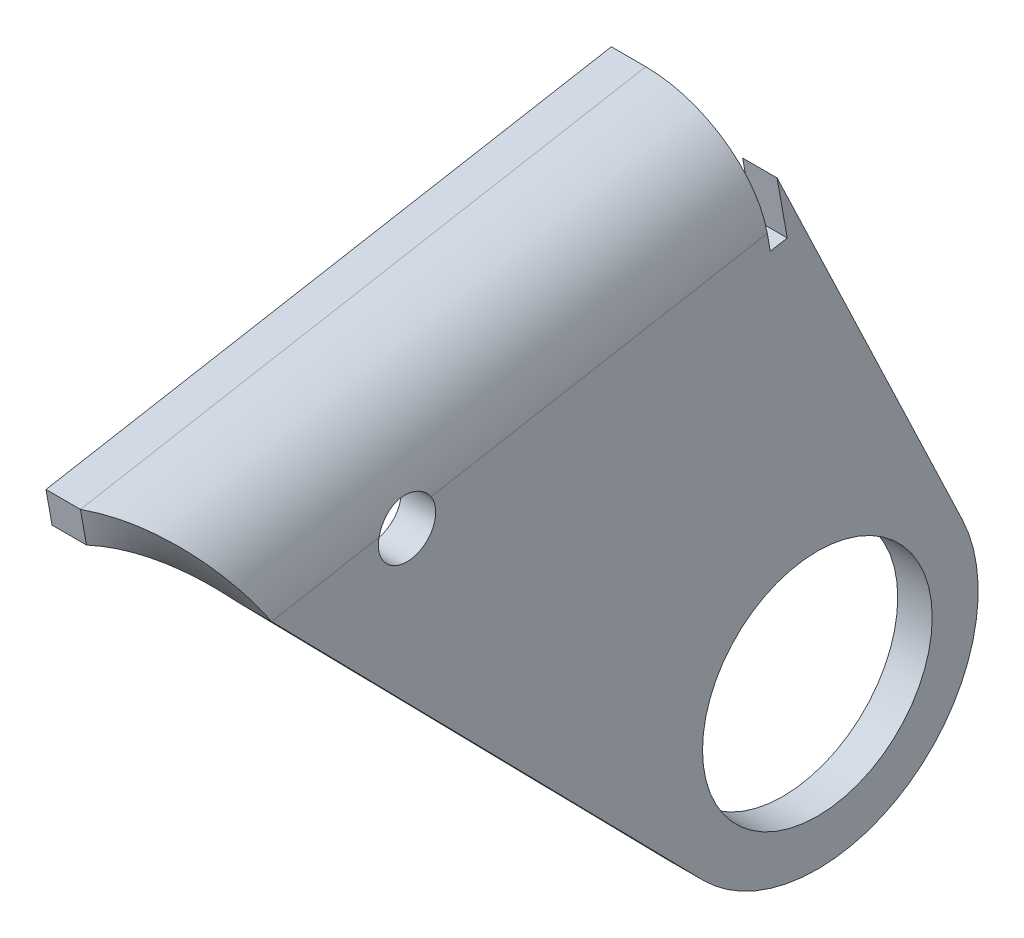
ISO-10303-21;
HEADER;
FILE_DESCRIPTION(('STEP AP214'),'2;1');
FILE_NAME('part.step','',(''),(''),'','','');
FILE_SCHEMA(('AUTOMOTIVE_DESIGN { 1 0 10303 214 1 1 1 1 }'));
ENDSEC;
DATA;
#1=APPLICATION_CONTEXT('core data for automotive mechanical design processes');
#2=APPLICATION_PROTOCOL_DEFINITION('international standard','automotive_design',2000,#1);
#3=PRODUCT_CONTEXT('',#1,'mechanical');
#4=PRODUCT('Part','Part','',(#3));
#5=PRODUCT_RELATED_PRODUCT_CATEGORY('part','',(#4));
#6=PRODUCT_DEFINITION_FORMATION('','',#4);
#7=PRODUCT_DEFINITION_CONTEXT('part definition',#1,'design');
#8=PRODUCT_DEFINITION('design','',#6,#7);
#9=PRODUCT_DEFINITION_SHAPE('','',#8);
#10=(LENGTH_UNIT() NAMED_UNIT(*) SI_UNIT(.MILLI.,.METRE.));
#11=(NAMED_UNIT(*) PLANE_ANGLE_UNIT() SI_UNIT($,.RADIAN.));
#12=(NAMED_UNIT(*) SI_UNIT($,.STERADIAN.) SOLID_ANGLE_UNIT());
#13=UNCERTAINTY_MEASURE_WITH_UNIT(LENGTH_MEASURE(1.E-05),#10,'distance_accuracy_value','');
#14=(GEOMETRIC_REPRESENTATION_CONTEXT(3) GLOBAL_UNCERTAINTY_ASSIGNED_CONTEXT((#13)) GLOBAL_UNIT_ASSIGNED_CONTEXT((#10,
#11,#12)) REPRESENTATION_CONTEXT('',''));
#15=CARTESIAN_POINT('',(0.,0.,0.));
#16=DIRECTION('',(0.,0.,1.));
#17=DIRECTION('',(1.,0.,0.));
#18=AXIS2_PLACEMENT_3D('',#15,#16,#17);
#19=CARTESIAN_POINT('',(3.,6.02391953035933,-12.6377368817267));
#20=DIRECTION('',(0.,0.430279966454238,-0.902695491551908));
#21=DIRECTION('',(0.,-0.902695491551908,-0.430279966454238));
#22=AXIS2_PLACEMENT_3D('',#19,#20,#21);
#23=PLANE('',#22);
#24=DIRECTION('',(0.,-0.902695491551908,-0.430279966454238));
#25=VECTOR('',#24,1.);
#26=CARTESIAN_POINT('',(3.,6.02391953035933,-12.6377368817267));
#27=LINE('',#26,#25);
#28=CARTESIAN_POINT('',(3.,39.8963585818371,3.50794244778505));
#29=VERTEX_POINT('',#28);
#30=CARTESIAN_POINT('',(3.,6.02391953035933,-12.6377368817267));
#31=VERTEX_POINT('',#30);
#32=EDGE_CURVE('E255',#29,#31,#27,.T.);
#33=ORIENTED_EDGE('',*,*,#32,.T.);
#34=DIRECTION('',(1.,0.,0.));
#35=VECTOR('',#34,1.);
#36=CARTESIAN_POINT('',(3.,6.02391953035933,-12.6377368817267));
#37=LINE('',#36,#35);
#38=CARTESIAN_POINT('',(0.,6.02391953035933,-12.6377368817267));
#39=VERTEX_POINT('',#38);
#40=EDGE_CURVE('E11',#39,#31,#37,.T.);
#41=ORIENTED_EDGE('',*,*,#40,.F.);
#42=DIRECTION('',(0.,-0.902695491551908,-0.430279966454238));
#43=VECTOR('',#42,1.);
#44=CARTESIAN_POINT('',(0.,6.02391953035933,-12.6377368817267));
#45=LINE('',#44,#43);
#46=CARTESIAN_POINT('',(0.,39.8963585818371,3.50794244778505));
#47=VERTEX_POINT('',#46);
#48=EDGE_CURVE('E239',#47,#39,#45,.T.);
#49=ORIENTED_EDGE('',*,*,#48,.F.);
#50=DIRECTION('',(1.,0.,0.));
#51=VECTOR('',#50,1.);
#52=CARTESIAN_POINT('',(0.,39.8963585818371,3.50794244778505));
#53=LINE('',#52,#51);
#54=EDGE_CURVE('E525',#47,#29,#53,.T.);
#55=ORIENTED_EDGE('',*,*,#54,.T.);
#56=EDGE_LOOP('',(#33,#41,#49,#55));
#57=FACE_BOUND('',#56,.T.);
#58=ADVANCED_FACE('F41',(#57),#23,.T.);
#59=CARTESIAN_POINT('',(3.,-9.80528539738687,9.9928163335364));
#60=DIRECTION('',(0.,-0.700377528384777,0.7137725952526));
#61=DIRECTION('',(0.,0.7137725952526,0.700377528384777));
#62=AXIS2_PLACEMENT_3D('',#59,#60,#61);
#63=PLANE('',#62);
#64=DIRECTION('',(0.,0.7137725952526,0.700377528384777));
#65=VECTOR('',#64,1.);
#66=CARTESIAN_POINT('',(0.,-9.80528539738687,9.9928163335364));
#67=LINE('',#66,#65);
#68=CARTESIAN_POINT('',(0.,-9.80528539738687,9.9928163335364));
#69=VERTEX_POINT('',#68);
#70=CARTESIAN_POINT('',(0.,28.4500932309683,47.5302725336714));
#71=VERTEX_POINT('',#70);
#72=EDGE_CURVE('E156',#69,#71,#67,.T.);
#73=ORIENTED_EDGE('',*,*,#72,.F.);
#74=DIRECTION('',(1.,0.,0.));
#75=VECTOR('',#74,1.);
#76=CARTESIAN_POINT('',(3.,-9.80528539738687,9.9928163335364));
#77=LINE('',#76,#75);
#78=CARTESIAN_POINT('',(3.,-9.80528539738687,9.9928163335364));
#79=VERTEX_POINT('',#78);
#80=EDGE_CURVE('E45',#69,#79,#77,.T.);
#81=ORIENTED_EDGE('',*,*,#80,.T.);
#82=DIRECTION('',(0.,0.7137725952526,0.700377528384777));
#83=VECTOR('',#82,1.);
#84=CARTESIAN_POINT('',(3.,-9.80528539738687,9.9928163335364));
#85=LINE('',#84,#83);
#86=CARTESIAN_POINT('',(3.00000000000002,28.4500932309683,47.5302725336714));
#87=VERTEX_POINT('',#86);
#88=EDGE_CURVE('E252',#79,#87,#85,.T.);
#89=ORIENTED_EDGE('',*,*,#88,.T.);
#90=DIRECTION('',(1.,0.,0.));
#91=VECTOR('',#90,1.);
#92=CARTESIAN_POINT('',(0.,28.4500932309683,47.5302725336714));
#93=LINE('',#92,#91);
#94=EDGE_CURVE('E238',#71,#87,#93,.T.);
#95=ORIENTED_EDGE('',*,*,#94,.F.);
#96=EDGE_LOOP('',(#73,#81,#89,#95));
#97=FACE_BOUND('',#96,.T.);
#98=ADVANCED_FACE('F220',(#97),#63,.T.);
#99=CARTESIAN_POINT('',(3.,0.,0.));
#100=DIRECTION('',(1.,0.,0.));
#101=DIRECTION('',(0.,0.,1.));
#102=AXIS2_PLACEMENT_3D('',#99,#100,#101);
#103=PLANE('',#102);
#104=CARTESIAN_POINT('',(3.,29.5616466641998,35.7330467634988));
#105=DIRECTION('',(-1.,0.,0.));
#106=DIRECTION('',(0.,0.,1.));
#107=AXIS2_PLACEMENT_3D('',#104,#105,#106);
#108=CIRCLE('',#107,2.5);
#109=CARTESIAN_POINT('',(3.00000000000001,30.9247946626455,33.6373780076279));
#110=VERTEX_POINT('',#109);
#111=CARTESIAN_POINT('',(3.00000000000002,30.1173209026301,38.1705098177305));
#112=VERTEX_POINT('',#111);
#113=EDGE_CURVE('E472',#110,#112,#108,.T.);
#114=ORIENTED_EDGE('',*,*,#113,.T.);
#115=DIRECTION('',(0.,-0.175366726091987,0.984503179974437));
#116=VECTOR('',#115,1.);
#117=CARTESIAN_POINT('',(3.00000000000002,27.3711350756307,53.5875090383433));
#118=LINE('',#117,#116);
#119=EDGE_CURVE('E507',#87,#112,#118,.F.);
#120=ORIENTED_EDGE('',*,*,#119,.F.);
#121=ORIENTED_EDGE('',*,*,#88,.F.);
#122=CARTESIAN_POINT('',(3.,0.,0.));
#123=DIRECTION('',(-1.,0.,0.));
#124=DIRECTION('',(0.,0.,1.));
#125=AXIS2_PLACEMENT_3D('',#122,#123,#124);
#126=CIRCLE('',#125,14.);
#127=EDGE_CURVE('E249',#31,#79,#126,.T.);
#128=ORIENTED_EDGE('',*,*,#127,.F.);
#129=ORIENTED_EDGE('',*,*,#32,.F.);
#130=DIRECTION('',(0.,0.984503179974436,0.175366726091989));
#131=VECTOR('',#130,1.);
#132=CARTESIAN_POINT('',(3.,0.6213091049295,-3.48800940281742));
#133=LINE('',#132,#131);
#134=CARTESIAN_POINT('',(3.,34.9257666994064,2.62254518052185));
#135=VERTEX_POINT('',#134);
#136=EDGE_CURVE('E532',#135,#29,#133,.T.);
#137=ORIENTED_EDGE('',*,*,#136,.F.);
#138=DIRECTION('',(0.,0.175366726091988,-0.984503179974436));
#139=VECTOR('',#138,1.);
#140=CARTESIAN_POINT('',(3.,34.3044575944769,6.11055458333925));
#141=LINE('',#140,#139);
#142=CARTESIAN_POINT('',(3.,34.6627166102684,4.09929995048351));
#143=VERTEX_POINT('',#142);
#144=EDGE_CURVE('E533',#143,#135,#141,.T.);
#145=ORIENTED_EDGE('',*,*,#144,.F.);
#146=DIRECTION('',(0.,-0.984503179974436,-0.175366726091988));
#147=VECTOR('',#146,1.);
#148=CARTESIAN_POINT('',(3.,0.358259015791509,-2.01125463285573));
#149=LINE('',#148,#147);
#150=CARTESIAN_POINT('',(3.,36.1394713802301,4.36235003962149));
#151=VERTEX_POINT('',#150);
#152=EDGE_CURVE('E245',#151,#143,#149,.T.);
#153=ORIENTED_EDGE('',*,*,#152,.F.);
#154=EDGE_CURVE('E508',#110,#151,#118,.F.);
#155=ORIENTED_EDGE('',*,*,#154,.F.);
#156=EDGE_LOOP('',(#114,#120,#121,#128,#129,#137,#145,#153,#155));
#157=FACE_BOUND('',#156,.T.);
#158=CARTESIAN_POINT('',(3.,0.,0.));
#159=DIRECTION('',(-1.,0.,0.));
#160=DIRECTION('',(0.,0.,1.));
#161=AXIS2_PLACEMENT_3D('',#158,#159,#160);
#162=CIRCLE('',#161,10.);
#163=CARTESIAN_POINT('',(3.,0.,10.));
#164=VERTEX_POINT('',#163);
#165=EDGE_CURVE('E262',#164,#164,#162,.T.);
#166=ORIENTED_EDGE('',*,*,#165,.T.);
#167=EDGE_LOOP('',(#166));
#168=FACE_BOUND('',#167,.T.);
#169=ADVANCED_FACE('F217',(#157,#168),#103,.T.);
#170=CARTESIAN_POINT('',(0.,0.,0.));
#171=DIRECTION('',(1.,0.,0.));
#172=DIRECTION('',(0.,0.,1.));
#173=AXIS2_PLACEMENT_3D('',#170,#171,#172);
#174=PLANE('',#173);
#175=CARTESIAN_POINT('',(0.,0.,0.));
#176=DIRECTION('',(-1.,0.,0.));
#177=DIRECTION('',(0.,0.,1.));
#178=AXIS2_PLACEMENT_3D('',#175,#176,#177);
#179=CIRCLE('',#178,10.);
#180=CARTESIAN_POINT('',(0.,0.,10.));
#181=VERTEX_POINT('',#180);
#182=EDGE_CURVE('E243',#181,#181,#179,.T.);
#183=ORIENTED_EDGE('',*,*,#182,.F.);
#184=EDGE_LOOP('',(#183));
#185=FACE_BOUND('',#184,.T.);
#186=DIRECTION('',(0.,-0.175366726091987,0.984503179974437));
#187=VECTOR('',#186,1.);
#188=CARTESIAN_POINT('',(0.,27.3711350756307,53.5875090383433));
#189=LINE('',#188,#187);
#190=CARTESIAN_POINT('',(0.,30.9247946626455,33.6373780076279));
#191=VERTEX_POINT('',#190);
#192=CARTESIAN_POINT('',(0.,36.1394713802301,4.36235003962149));
#193=VERTEX_POINT('',#192);
#194=EDGE_CURVE('E149',#191,#193,#189,.F.);
#195=ORIENTED_EDGE('',*,*,#194,.T.);
#196=DIRECTION('',(0.,-0.984503179974436,-0.175366726091988));
#197=VECTOR('',#196,1.);
#198=CARTESIAN_POINT('',(0.,36.1394713802301,4.36235003962149));
#199=LINE('',#198,#197);
#200=CARTESIAN_POINT('',(0.,34.6627166102684,4.09929995048351));
#201=VERTEX_POINT('',#200);
#202=EDGE_CURVE('E187',#193,#201,#199,.T.);
#203=ORIENTED_EDGE('',*,*,#202,.T.);
#204=DIRECTION('',(0.,0.175366726091988,-0.984503179974436));
#205=VECTOR('',#204,1.);
#206=CARTESIAN_POINT('',(0.,34.6627166102684,4.09929995048351));
#207=LINE('',#206,#205);
#208=CARTESIAN_POINT('',(0.,34.9257666994064,2.62254518052185));
#209=VERTEX_POINT('',#208);
#210=EDGE_CURVE('E531',#201,#209,#207,.T.);
#211=ORIENTED_EDGE('',*,*,#210,.T.);
#212=DIRECTION('',(0.,0.984503179974436,0.175366726091989));
#213=VECTOR('',#212,1.);
#214=CARTESIAN_POINT('',(0.,34.9257666994064,2.62254518052185));
#215=LINE('',#214,#213);
#216=EDGE_CURVE('E521',#209,#47,#215,.T.);
#217=ORIENTED_EDGE('',*,*,#216,.T.);
#218=ORIENTED_EDGE('',*,*,#48,.T.);
#219=CARTESIAN_POINT('',(0.,0.,0.));
#220=DIRECTION('',(-1.,0.,0.));
#221=DIRECTION('',(0.,0.,1.));
#222=AXIS2_PLACEMENT_3D('',#219,#220,#221);
#223=CIRCLE('',#222,14.);
#224=EDGE_CURVE('E240',#39,#69,#223,.T.);
#225=ORIENTED_EDGE('',*,*,#224,.T.);
#226=ORIENTED_EDGE('',*,*,#72,.T.);
#227=CARTESIAN_POINT('',(0.,30.1173209026301,38.1705098177305));
#228=VERTEX_POINT('',#227);
#229=EDGE_CURVE('E146',#71,#228,#189,.F.);
#230=ORIENTED_EDGE('',*,*,#229,.T.);
#231=CARTESIAN_POINT('',(0.,29.5616466641998,35.7330467634988));
#232=DIRECTION('',(1.,0.,0.));
#233=DIRECTION('',(0.,0.,-1.));
#234=AXIS2_PLACEMENT_3D('',#231,#232,#233);
#235=CIRCLE('',#234,2.49999999999999);
#236=EDGE_CURVE('E138',#228,#191,#235,.T.);
#237=ORIENTED_EDGE('',*,*,#236,.T.);
#238=EDGE_LOOP('',(#195,#203,#211,#217,#218,#225,#226,#230,#237));
#239=FACE_BOUND('',#238,.T.);
#240=ADVANCED_FACE('F154',(#185,#239),#174,.F.);
#241=CARTESIAN_POINT('',(3.,0.,0.));
#242=DIRECTION('',(1.,0.,0.));
#243=DIRECTION('',(0.,0.,1.));
#244=AXIS2_PLACEMENT_3D('',#241,#242,#243);
#245=CYLINDRICAL_SURFACE('',#244,14.);
#246=ORIENTED_EDGE('',*,*,#40,.T.);
#247=ORIENTED_EDGE('',*,*,#127,.T.);
#248=ORIENTED_EDGE('',*,*,#80,.F.);
#249=ORIENTED_EDGE('',*,*,#224,.F.);
#250=EDGE_LOOP('',(#246,#247,#248,#249));
#251=FACE_BOUND('',#250,.T.);
#252=ADVANCED_FACE('F224',(#251),#245,.T.);
#253=CARTESIAN_POINT('',(3.,0.,0.));
#254=DIRECTION('',(1.,0.,0.));
#255=DIRECTION('',(0.,0.,1.));
#256=AXIS2_PLACEMENT_3D('',#253,#254,#255);
#257=CYLINDRICAL_SURFACE('',#256,10.);
#258=ORIENTED_EDGE('',*,*,#165,.F.);
#259=EDGE_LOOP('',(#258));
#260=FACE_BOUND('',#259,.T.);
#261=ORIENTED_EDGE('',*,*,#182,.T.);
#262=EDGE_LOOP('',(#261));
#263=FACE_BOUND('',#262,.T.);
#264=ADVANCED_FACE('F43',(#260,#263),#257,.F.);
#265=CARTESIAN_POINT('',(0.,36.1394713802301,4.36235003962149));
#266=DIRECTION('',(0.,0.175366726091988,-0.984503179974436));
#267=DIRECTION('',(0.,-0.984503179974436,-0.175366726091988));
#268=AXIS2_PLACEMENT_3D('',#265,#266,#267);
#269=PLANE('',#268);
#270=ORIENTED_EDGE('',*,*,#152,.T.);
#271=DIRECTION('',(1.,0.,0.));
#272=VECTOR('',#271,1.);
#273=CARTESIAN_POINT('',(0.,34.6627166102684,4.09929995048351));
#274=LINE('',#273,#272);
#275=EDGE_CURVE('E529',#201,#143,#274,.T.);
#276=ORIENTED_EDGE('',*,*,#275,.F.);
#277=ORIENTED_EDGE('',*,*,#202,.F.);
#278=DIRECTION('',(1.,0.,0.));
#279=VECTOR('',#278,1.);
#280=CARTESIAN_POINT('',(0.,36.1394713802301,4.36235003962149));
#281=LINE('',#280,#279);
#282=EDGE_CURVE('E515',#193,#151,#281,.T.);
#283=ORIENTED_EDGE('',*,*,#282,.T.);
#284=EDGE_LOOP('',(#270,#276,#277,#283));
#285=FACE_BOUND('',#284,.T.);
#286=ADVANCED_FACE('F212',(#285),#269,.T.);
#287=CARTESIAN_POINT('',(0.,34.6627166102684,4.09929995048351));
#288=DIRECTION('',(0.,0.984503179974436,0.175366726091988));
#289=DIRECTION('',(0.,0.175366726091988,-0.984503179974436));
#290=AXIS2_PLACEMENT_3D('',#287,#288,#289);
#291=PLANE('',#290);
#292=ORIENTED_EDGE('',*,*,#144,.T.);
#293=DIRECTION('',(1.,0.,0.));
#294=VECTOR('',#293,1.);
#295=CARTESIAN_POINT('',(0.,34.9257666994064,2.62254518052185));
#296=LINE('',#295,#294);
#297=EDGE_CURVE('E517',#209,#135,#296,.T.);
#298=ORIENTED_EDGE('',*,*,#297,.F.);
#299=ORIENTED_EDGE('',*,*,#210,.F.);
#300=ORIENTED_EDGE('',*,*,#275,.T.);
#301=EDGE_LOOP('',(#292,#298,#299,#300));
#302=FACE_BOUND('',#301,.T.);
#303=ADVANCED_FACE('F208',(#302),#291,.T.);
#304=CARTESIAN_POINT('',(0.,34.9257666994064,2.62254518052185));
#305=DIRECTION('',(0.,-0.175366726091989,0.984503179974436));
#306=DIRECTION('',(0.,0.984503179974436,0.175366726091989));
#307=AXIS2_PLACEMENT_3D('',#304,#305,#306);
#308=PLANE('',#307);
#309=ORIENTED_EDGE('',*,*,#136,.T.);
#310=ORIENTED_EDGE('',*,*,#54,.F.);
#311=ORIENTED_EDGE('',*,*,#216,.F.);
#312=ORIENTED_EDGE('',*,*,#297,.T.);
#313=EDGE_LOOP('',(#309,#310,#311,#312));
#314=FACE_BOUND('',#313,.T.);
#315=ADVANCED_FACE('F199',(#314),#308,.T.);
#316=CARTESIAN_POINT('',(-6.00000000000001,36.1394713802301,4.36235003962149));
#317=DIRECTION('',(0.,0.175366726091987,-0.984503179974437));
#318=DIRECTION('',(0.,-0.984503179974437,-0.175366726091987));
#319=AXIS2_PLACEMENT_3D('',#316,#317,#318);
#320=PLANE('',#319);
#321=DIRECTION('',(0.,0.984503179974437,0.175366726091987));
#322=VECTOR('',#321,1.);
#323=CARTESIAN_POINT('',(-5.99999999999997,45.,5.94065057444939));
#324=LINE('',#323,#322);
#325=CARTESIAN_POINT('',(-5.99999999999998,42.0464904600767,5.41455039617342));
#326=VERTEX_POINT('',#325);
#327=CARTESIAN_POINT('',(-5.99999999999997,45.,5.94065057444937));
#328=VERTEX_POINT('',#327);
#329=EDGE_CURVE('E476',#326,#328,#324,.T.);
#330=ORIENTED_EDGE('',*,*,#329,.T.);
#331=CARTESIAN_POINT('',(-6.00000000000001,36.1394713802301,4.36235003962148));
#332=DIRECTION('',(0.,0.175366726091987,-0.984503179974437));
#333=DIRECTION('',(0.,0.984503179974437,0.175366726091987));
#334=AXIS2_PLACEMENT_3D('',#331,#332,#333);
#335=CIRCLE('',#334,9.00000000000002);
#336=EDGE_CURVE('E505',#151,#328,#335,.F.);
#337=ORIENTED_EDGE('',*,*,#336,.F.);
#338=ORIENTED_EDGE('',*,*,#282,.F.);
#339=CARTESIAN_POINT('',(-6.00000000000001,36.1394713802301,4.36235003962149));
#340=DIRECTION('',(0.,0.175366726091987,-0.984503179974437));
#341=DIRECTION('',(0.,0.984503179974437,0.175366726091987));
#342=AXIS2_PLACEMENT_3D('',#339,#340,#341);
#343=CIRCLE('',#342,6.00000000000002);
#344=EDGE_CURVE('E157',#193,#326,#343,.F.);
#345=ORIENTED_EDGE('',*,*,#344,.T.);
#346=EDGE_LOOP('',(#330,#337,#338,#345));
#347=FACE_BOUND('',#346,.T.);
#348=ADVANCED_FACE('F198',(#347),#320,.T.);
#349=CARTESIAN_POINT('',(-5.99999999999996,36.2611987907999,55.171070574954));
#350=CARTESIAN_POINT('',(-4.81779638789633,36.3511256226338,54.6662242230919));
#351=CARTESIAN_POINT('',(-3.63641660423566,36.2096405872688,54.1203152893797));
#352=CARTESIAN_POINT('',(-1.45232060725075,35.4988044599935,52.9521247192644));
#353=CARTESIAN_POINT('',(-0.450643118626488,34.929790153516,52.3299821484547));
#354=CARTESIAN_POINT('',(1.22099158685559,33.4638868294362,51.0272936254872));
#355=CARTESIAN_POINT('',(1.89029108683897,32.5676453361882,50.3468630149845));
#356=CARTESIAN_POINT('',(2.79497327031491,30.5972222410101,48.9543058330773));
#357=CARTESIAN_POINT('',(3.03000000000002,29.5240496146276,48.2424380625623));
#358=CARTESIAN_POINT('',(3.03000000000002,28.4500932309683,47.5302725336714));
#359=CARTESIAN_POINT('',(-5.99999999999996,36.2316636954007,55.1658095731712));
#360=CARTESIAN_POINT('',(-4.82172417163385,36.3215905046082,54.6609633483328));
#361=CARTESIAN_POINT('',(-3.64426904076644,36.1808742113472,54.1151912173914));
#362=CARTESIAN_POINT('',(-1.46742917666187,35.4729970956549,52.9475277275176));
#363=CARTESIAN_POINT('',(-0.469079520225736,34.9061719170382,52.3257750997712));
#364=CARTESIAN_POINT('',(1.19700158158365,33.4457361334344,51.0240604940979));
#365=CARTESIAN_POINT('',(1.86407749518834,32.5527709015581,50.3442134746309));
#366=CARTESIAN_POINT('',(2.76575409001486,30.589491492275,48.9529287769911));
#367=CARTESIAN_POINT('',(3.00000000000002,29.5201827216741,48.2417491329637));
#368=CARTESIAN_POINT('',(3.00000000000002,28.4500932309683,47.5302725336714));
#369=CARTESIAN_POINT('',(-5.99999999999998,33.2781541554774,54.6397093948953));
#370=CARTESIAN_POINT('',(-5.21450254538538,33.3680787020482,54.1348758724268));
#371=CARTESIAN_POINT('',(-4.42951269384429,33.3042366191827,53.6027840185603));
#372=CARTESIAN_POINT('',(-2.97828611777458,32.8922606617955,52.4878285528293));
#373=CARTESIAN_POINT('',(-2.31271968015049,32.5443482692548,51.9050702314242));
#374=CARTESIAN_POINT('',(-1.2019989456109,31.6306665332599,50.7007473551602));
#375=CARTESIAN_POINT('',(-0.757281669874432,31.0653274385462,50.0792594392747));
#376=CARTESIAN_POINT('',(-0.156163939990088,29.8164166187651,48.8152231683663));
#377=CARTESIAN_POINT('',(0.,29.1334934263273,48.1728561731093));
#378=CARTESIAN_POINT('',(0.,28.4500932309683,47.5302725336714));
#379=CARTESIAN_POINT('',(-5.99999999999998,33.2483237091241,54.6343957830947));
#380=CARTESIAN_POINT('',(-5.21846960696027,33.3382482328424,54.1295623889201));
#381=CARTESIAN_POINT('',(-4.43744365474038,33.2751825795018,53.5976087058521));
#382=CARTESIAN_POINT('',(-2.99354577287982,32.8661952238135,52.4831855911649));
#383=CARTESIAN_POINT('',(-2.33134044576573,32.5204938504122,51.9008211122539));
#384=CARTESIAN_POINT('',(-1.22622885093556,31.6123343302982,50.6974818924569));
#385=CARTESIAN_POINT('',(-0.783757397441566,31.0503042595698,50.0765834035176));
#386=CARTESIAN_POINT('',(-0.185675312093138,29.8086085625427,48.8138323417192));
#387=CARTESIAN_POINT('',(-0.0302999999999825,29.1295878644443,48.1721603542147));
#388=CARTESIAN_POINT('',(-0.0302999999999835,28.4500932309683,47.5302725336714));
#389=B_SPLINE_SURFACE_WITH_KNOTS('',1,3,((#349,#350,#351,#352,#353,#354,#355,#356,#357,#358),
(#359,#360,#361,#362,#363,#364,#365,#366,#367,#368),(#369,#370,#371,#372,#373,#374,#375,#376,
#377,#378),(#379,#380,#381,#382,#383,#384,#385,#386,#387,#388)),.UNSPECIFIED.,.F.,.F.,.F.,(2,1,
1,2),(4,2,2,2,4),(-0.01,0.,1.,1.0101),(0.,0.25,0.5,0.75,1.),.UNSPECIFIED.);
#390=CARTESIAN_POINT('',(-5.99999999999998,33.2781541554774,54.6397093948953));
#391=CARTESIAN_POINT('',(-5.79840700315166,33.3012706390728,54.5101460110807));
#392=CARTESIAN_POINT('',(-5.59681685404913,33.3143121744097,54.3787934595483));
#393=CARTESIAN_POINT('',(-5.19568980835894,33.3205069851272,54.1125601071084));
#394=CARTESIAN_POINT('',(-4.99615277315181,33.3136616121663,53.9776795466074));
#395=CARTESIAN_POINT('',(-4.60128398713057,33.2803584829875,53.7045142532093));
#396=CARTESIAN_POINT('',(-4.40594950625135,33.2539138805872,53.5662318635643));
#397=CARTESIAN_POINT('',(-4.02133372935112,33.1819442739728,53.2862639180282));
#398=CARTESIAN_POINT('',(-3.83205233163214,33.1364195905052,53.1445784193828));
#399=CARTESIAN_POINT('',(-3.46115344645292,33.026891756896,52.8576982871905));
#400=CARTESIAN_POINT('',(-3.27954888245742,32.9628587663546,52.712498336565));
#401=CARTESIAN_POINT('',(-2.92617125384106,32.8172243406882,52.4189788373691));
#402=CARTESIAN_POINT('',(-2.75439819342232,32.7356228980543,52.2706592874653));
#403=CARTESIAN_POINT('',(-2.42251703419809,32.5559650227041,51.9711487415818));
#404=CARTESIAN_POINT('',(-2.26240344299638,32.4579164105708,51.8199591404621));
#405=CARTESIAN_POINT('',(-1.95537998020967,32.2465707998169,51.5148604599727));
#406=CARTESIAN_POINT('',(-1.80846994163327,32.1332739940924,51.3609514150264));
#407=CARTESIAN_POINT('',(-1.52933171052846,31.8928064082991,51.0506521388807));
#408=CARTESIAN_POINT('',(-1.39710452254301,31.7656346801411,50.8942617387522));
#409=CARTESIAN_POINT('',(-1.14868007224119,31.4989383931669,50.5792874535995));
#410=CARTESIAN_POINT('',(-1.03248320917623,31.3594135268255,50.4207035140511));
#411=CARTESIAN_POINT('',(-0.817271018805133,31.069624822314,50.101567882325));
#412=CARTESIAN_POINT('',(-0.718262100227296,30.9193570078663,49.9410154799691));
#413=CARTESIAN_POINT('',(-0.538489061616165,30.6098964688685,49.618324544138));
#414=CARTESIAN_POINT('',(-0.457723447878997,30.4507044763348,49.4561861416545));
#415=CARTESIAN_POINT('',(-0.322761760229901,30.1424098358609,49.1478203147089));
#416=CARTESIAN_POINT('',(-0.266662501535003,29.9940122441144,49.0017170820071));
#417=CARTESIAN_POINT('',(-0.170165591777028,29.6929291437537,48.7087612357832));
#418=CARTESIAN_POINT('',(-0.129766744849002,29.5402439626657,48.5619086801989));
#419=CARTESIAN_POINT('',(-0.0650153257420017,29.232043502309,48.2677320127287));
#420=CARTESIAN_POINT('',(-0.0406580379608848,29.0765290685581,48.1204080522256));
#421=CARTESIAN_POINT('',(-0.00813762935923698,28.764041663206,47.8254813202277));
#422=CARTESIAN_POINT('',(2.34748613042869E-05,28.607068512423,47.6778785163037));
#423=CARTESIAN_POINT('',(0.,28.4500932309683,47.5302725336714));
#424=B_SPLINE_CURVE_WITH_KNOTS('',3,(#390,#391,#392,#393,#394,#395,#396,#397,#398,#399,#400,
#401,#402,#403,#404,#405,#406,#407,#408,#409,#410,#411,#412,#413,#414,#415,#416,#417,#418,#419,
#420,#421,#422,#423),.UNSPECIFIED.,.F.,.F.,(4,2,2,2,2,2,2,2,2,2,2,2,2,2,2,2,4),(0.,
0.722028068026029,1.44400706293413,2.16550194748673,2.88698470381383,3.60963723668521,
4.33229007842451,5.05460026977002,5.77690132443991,6.49925176570233,7.22162019458432,
7.94425739125811,8.66683539922846,9.31325418401051,9.95962372287764,10.6058031690207,
11.2520630664457),.UNSPECIFIED.);
#425=CARTESIAN_POINT('',(-5.99999999999998,33.2781541554774,54.6397093948953));
#426=VERTEX_POINT('',#425);
#427=EDGE_CURVE('E163',#426,#71,#424,.T.);
#428=CARTESIAN_POINT('',(-5.99999999999996,36.2316636954007,55.1658095731712));
#429=CARTESIAN_POINT('',(-5.7656481157098,36.2495695023161,55.0653988089317));
#430=CARTESIAN_POINT('',(-5.53129972836042,36.2584256137415,54.963376904598));
#431=CARTESIAN_POINT('',(-5.064062632819,36.2581782363636,54.7561518946781));
#432=CARTESIAN_POINT('',(-4.83117372228384,36.2490772949909,54.6509492424053));
#433=CARTESIAN_POINT('',(-4.3681474577453,36.2130533274203,54.4373321699978));
#434=CARTESIAN_POINT('',(-4.13801125342617,36.1861231023177,54.3289164694326));
#435=CARTESIAN_POINT('',(-3.68197862601275,36.1147153310861,54.1089461111727));
#436=CARTESIAN_POINT('',(-3.45608268073134,36.0702358197066,53.9973911032234));
#437=CARTESIAN_POINT('',(-2.97032414902065,35.9546809965589,53.7511421330958));
#438=CARTESIAN_POINT('',(-2.71154470407202,35.8802874625537,53.6158539368477));
#439=CARTESIAN_POINT('',(-2.20397403387972,35.7084881457458,53.3411683545748));
#440=CARTESIAN_POINT('',(-1.95518391078838,35.6110798317704,53.2017705180474));
#441=CARTESIAN_POINT('',(-1.4697124843948,35.3942529594943,52.9190638842012));
#442=CARTESIAN_POINT('',(-1.23303102115928,35.2748346920008,52.7757551385767));
#443=CARTESIAN_POINT('',(-0.773790984137131,35.015183444301,52.4854341447145));
#444=CARTESIAN_POINT('',(-0.551231981811237,34.8749510961194,52.3384220090437));
#445=CARTESIAN_POINT('',(-0.122111006429101,34.5750362597331,52.0409218057773));
#446=CARTESIAN_POINT('',(0.0844507297011521,34.4153534835498,51.8904336867439));
#447=CARTESIAN_POINT('',(0.47983177651848,34.0780622930823,51.5862641494924));
#448=CARTESIAN_POINT('',(0.668650842926369,33.9004536320661,51.4325826873444));
#449=CARTESIAN_POINT('',(1.02700340803573,33.5289326852942,51.1222810521355));
#450=CARTESIAN_POINT('',(1.19653072804733,33.3350152105993,50.9656599561846));
#451=CARTESIAN_POINT('',(1.51478992647841,32.9327504698536,50.6498566730318));
#452=CARTESIAN_POINT('',(1.66352237079872,32.7244035967077,50.4906745556559));
#453=CARTESIAN_POINT('',(1.93899849518456,32.2951273309464,50.1700013887552));
#454=CARTESIAN_POINT('',(2.06573190619918,32.0741921257256,50.0085092988131));
#455=CARTESIAN_POINT('',(2.29605397590279,31.6218721982528,49.6836648535223));
#456=CARTESIAN_POINT('',(2.39964269522499,31.3904875033776,49.5203125030482));
#457=CARTESIAN_POINT('',(2.58270447170167,30.9196494539582,49.1922961460751));
#458=CARTESIAN_POINT('',(2.66220176562212,30.6802044796606,49.0276336299969));
#459=CARTESIAN_POINT('',(2.79652466297366,30.1953099429633,48.6972933991599));
#460=CARTESIAN_POINT('',(2.85136041295256,29.9498628939152,48.5316161303939));
#461=CARTESIAN_POINT('',(2.92906047065998,29.495380155509,48.226578655153));
#462=CARTESIAN_POINT('',(2.9556725045546,29.2869101005929,48.0873175679128));
#463=CARTESIAN_POINT('',(2.99113478711638,28.8689946418873,47.8087980473293));
#464=CARTESIAN_POINT('',(3.00001614567723,28.6595515938536,47.6695400388045));
#465=CARTESIAN_POINT('',(3.00000000000002,28.4500932309683,47.5302725336714));
#466=B_SPLINE_CURVE_WITH_KNOTS('',3,(#428,#429,#430,#431,#432,#433,#434,#435,#436,#437,#438,
#439,#440,#441,#442,#443,#444,#445,#446,#447,#448,#449,#450,#451,#452,#453,#454,#455,#456,#457,
#458,#459,#460,#461,#462,#463,#464,#465),.UNSPECIFIED.,.F.,.F.,(4,2,2,2,2,2,2,2,2,2,2,2,2,2,2,2,
2,2,4),(0.,0.766585117228358,1.53306149267471,2.2998475361015,3.06671947217152,3.9696296164621,
4.87263910935537,5.77563667206107,6.67860682062549,7.58159033998699,8.48458628970839,
9.38787063851118,10.2911304010222,11.1948106739082,12.0984885793535,13.0012543137603,
13.9036482809184,14.6593794175759,15.4137833937754),.UNSPECIFIED.);
#467=CARTESIAN_POINT('',(-5.99999999999997,36.2316636954006,55.1658095731712));
#468=VERTEX_POINT('',#467);
#469=EDGE_CURVE('E159',#468,#87,#466,.T.);
#470=DIRECTION('',(0.,0.984503179974437,0.175366726091987));
#471=VECTOR('',#470,1.);
#472=CARTESIAN_POINT('',(-5.99999999999998,33.2781541554773,54.6397093948953));
#473=LINE('',#472,#471);
#474=EDGE_CURVE('E497',#426,#468,#473,.T.);
#475=ORIENTED_EDGE('',*,*,#427,.T.);
#476=ORIENTED_EDGE('',*,*,#94,.T.);
#477=ORIENTED_EDGE('',*,*,#469,.F.);
#478=ORIENTED_EDGE('',*,*,#474,.F.);
#479=EDGE_LOOP('',(#475,#476,#477,#478));
#480=FACE_BOUND('',#479,.T.);
#481=ADVANCED_FACE('F191',(#480),#389,.T.);
#482=CARTESIAN_POINT('',(-6.,27.3711350756307,53.5875090383433));
#483=DIRECTION('',(0.,-0.175366726091987,0.984503179974437));
#484=DIRECTION('',(0.,0.984503179974437,0.175366726091987));
#485=AXIS2_PLACEMENT_3D('',#482,#483,#484);
#486=CYLINDRICAL_SURFACE('',#485,9.00000000000002);
#487=CARTESIAN_POINT('',(3.00000000000002,30.1173209026301,38.1705098177305));
#488=CARTESIAN_POINT('',(3.00000485133128,30.1854195684406,38.1549929106541));
#489=CARTESIAN_POINT('',(2.99931050408437,30.2528574742924,38.1366093144332));
#490=CARTESIAN_POINT('',(2.99670813797762,30.3859274357656,38.0942806688368));
#491=CARTESIAN_POINT('',(2.99480034812983,30.4515598297019,38.0703366694131));
#492=CARTESIAN_POINT('',(2.98995891746858,30.5804744161666,38.0170887129308));
#493=CARTESIAN_POINT('',(2.98702664901714,30.6437596280837,37.9877919512003));
#494=CARTESIAN_POINT('',(2.98034937001108,30.7676168004133,37.9240496261683));
#495=CARTESIAN_POINT('',(2.97660433899157,30.8281886924597,37.8896039332266));
#496=CARTESIAN_POINT('',(2.96448391541514,31.0051905087391,37.7788970147323));
#497=CARTESIAN_POINT('',(2.95521746692678,31.1170373823196,37.6952117367965));
#498=CARTESIAN_POINT('',(2.93618310465033,31.325193409358,37.5104879351955));
#499=CARTESIAN_POINT('',(2.92641515123115,31.4215013323618,37.4094480386089));
#500=CARTESIAN_POINT('',(2.90803708387306,31.5970849992128,37.1914014169674));
#501=CARTESIAN_POINT('',(2.89944195392941,31.6761468901962,37.0742207299099));
#502=CARTESIAN_POINT('',(2.88507313310647,31.813478452257,36.8280880468312));
#503=CARTESIAN_POINT('',(2.87929940784363,31.8717483767172,36.6991361942841));
#504=CARTESIAN_POINT('',(2.87161049862202,31.9654125982852,36.4341264644362));
#505=CARTESIAN_POINT('',(2.86966736100225,32.0009713307464,36.2981275568979));
#506=CARTESIAN_POINT('',(2.86988960225454,32.0488263592589,36.0221057567824));
#507=CARTESIAN_POINT('',(2.87205476005337,32.0611239069568,35.8820830811293));
#508=CARTESIAN_POINT('',(2.88007886682581,32.0621316565049,35.6034937304032));
#509=CARTESIAN_POINT('',(2.88590013821945,32.0510797690937,35.4649266885291));
#510=CARTESIAN_POINT('',(2.90021755790371,32.0062497942242,35.1916691962313));
#511=CARTESIAN_POINT('',(2.90871377777589,31.9724710985694,35.0569788496531));
#512=CARTESIAN_POINT('',(2.92701400626733,31.8827203974173,34.7938309634143));
#513=CARTESIAN_POINT('',(2.93682991004719,31.8265361250886,34.6654466248098));
#514=CARTESIAN_POINT('',(2.95591036484646,31.6935385521408,34.4198248235615));
#515=CARTESIAN_POINT('',(2.96517492917946,31.6167257499004,34.3025870917117));
#516=CARTESIAN_POINT('',(2.98112922383506,31.4459345054157,34.084319051177));
#517=CARTESIAN_POINT('',(2.98786047166639,31.3522737835854,33.9830448138851));
#518=CARTESIAN_POINT('',(2.99493963908249,31.2002303866839,33.8436554669915));
#519=CARTESIAN_POINT('',(2.9967967471053,31.1475664347791,33.7992418961153));
#520=CARTESIAN_POINT('',(2.99932848629955,31.0387283144736,33.7148872718916));
#521=CARTESIAN_POINT('',(3.00000288789584,30.9825534667642,33.6749470882815));
#522=CARTESIAN_POINT('',(3.00000000000001,30.9247946626455,33.6373780076279));
#523=B_SPLINE_CURVE_WITH_KNOTS('',3,(#487,#488,#489,#490,#491,#492,#493,#494,#495,#496,#497,
#498,#499,#500,#501,#502,#503,#504,#505,#506,#507,#508,#509,#510,#511,#512,#513,#514,#515,#516,
#517,#518,#519,#520,#521,#522),.UNSPECIFIED.,.F.,.F.,(4,2,2,2,2,2,2,2,2,2,2,2,2,2,2,2,2,4),(0.,
0.209455884417729,0.418872250119525,0.628009156518012,0.837151329473869,1.25501584765637,
1.6729134382788,2.09573059945952,2.51854260777424,2.93825755859619,3.3579499245973,
3.77338661934853,4.1888344321213,4.60831536715285,5.02778616856896,5.44004742795206,
5.64658426142022,5.85316118131583),.UNSPECIFIED.);
#524=EDGE_CURVE('E55',#112,#110,#523,.T.);
#525=ORIENTED_EDGE('',*,*,#524,.T.);
#526=ORIENTED_EDGE('',*,*,#154,.T.);
#527=ORIENTED_EDGE('',*,*,#336,.T.);
#528=DIRECTION('',(0.,-0.175366726091988,0.984503179974437));
#529=VECTOR('',#528,1.);
#530=CARTESIAN_POINT('',(-5.99999999999997,36.2316636954006,55.1658095731712));
#531=LINE('',#530,#529);
#532=EDGE_CURVE('E494',#328,#468,#531,.T.);
#533=ORIENTED_EDGE('',*,*,#532,.T.);
#534=ORIENTED_EDGE('',*,*,#469,.T.);
#535=ORIENTED_EDGE('',*,*,#119,.T.);
#536=EDGE_LOOP('',(#525,#526,#527,#533,#534,#535));
#537=FACE_BOUND('',#536,.T.);
#538=ADVANCED_FACE('F197',(#537),#486,.T.);
#539=CARTESIAN_POINT('',(-6.,27.3711350756307,53.5875090383433));
#540=DIRECTION('',(0.,-0.175366726091987,0.984503179974437));
#541=DIRECTION('',(0.,0.984503179974437,0.175366726091987));
#542=AXIS2_PLACEMENT_3D('',#539,#540,#541);
#543=CYLINDRICAL_SURFACE('',#542,6.00000000000002);
#544=ORIENTED_EDGE('',*,*,#229,.F.);
#545=ORIENTED_EDGE('',*,*,#427,.F.);
#546=DIRECTION('',(0.,0.175366726091988,-0.984503179974437));
#547=VECTOR('',#546,1.);
#548=CARTESIAN_POINT('',(-5.99999999999998,42.0464904600767,5.41455039617343));
#549=LINE('',#548,#547);
#550=EDGE_CURVE('E500',#326,#426,#549,.F.);
#551=ORIENTED_EDGE('',*,*,#550,.F.);
#552=ORIENTED_EDGE('',*,*,#344,.F.);
#553=ORIENTED_EDGE('',*,*,#194,.F.);
#554=EDGE_CURVE('E136',#228,#191,#189,.F.);
#555=ORIENTED_EDGE('',*,*,#554,.F.);
#556=EDGE_LOOP('',(#544,#545,#551,#552,#553,#555));
#557=FACE_BOUND('',#556,.T.);
#558=ADVANCED_FACE('F143',(#557),#543,.F.);
#559=CARTESIAN_POINT('',(0.,36.2316636954006,55.1658095731712));
#560=DIRECTION('',(0.,-0.175366726091987,0.984503179974436));
#561=DIRECTION('',(0.,0.984503179974437,0.175366726091988));
#562=AXIS2_PLACEMENT_3D('',#559,#560,#561);
#563=PLANE('',#562);
#564=DIRECTION('',(1.,0.,0.));
#565=VECTOR('',#564,1.);
#566=CARTESIAN_POINT('',(0.,36.2316636954006,55.1658095731712));
#567=LINE('',#566,#565);
#568=CARTESIAN_POINT('',(-9.,36.2316636954007,55.1658095731712));
#569=VERTEX_POINT('',#568);
#570=EDGE_CURVE('E480',#569,#468,#567,.T.);
#571=ORIENTED_EDGE('',*,*,#570,.F.);
#572=DIRECTION('',(0.,-0.984503179974437,-0.175366726091987));
#573=VECTOR('',#572,1.);
#574=CARTESIAN_POINT('',(-9.,36.2316636954007,55.1658095731712));
#575=LINE('',#574,#573);
#576=CARTESIAN_POINT('',(-9.00000000000001,33.2781541554774,54.6397093948953));
#577=VERTEX_POINT('',#576);
#578=EDGE_CURVE('E165',#569,#577,#575,.T.);
#579=ORIENTED_EDGE('',*,*,#578,.T.);
#580=DIRECTION('',(-1.,0.,0.));
#581=VECTOR('',#580,1.);
#582=CARTESIAN_POINT('',(0.,33.2781541554773,54.6397093948952));
#583=LINE('',#582,#581);
#584=EDGE_CURVE('E487',#577,#426,#583,.F.);
#585=ORIENTED_EDGE('',*,*,#584,.T.);
#586=ORIENTED_EDGE('',*,*,#474,.T.);
#587=EDGE_LOOP('',(#571,#579,#585,#586));
#588=FACE_BOUND('',#587,.T.);
#589=ADVANCED_FACE('F306',(#588),#563,.T.);
#590=CARTESIAN_POINT('',(-9.,45.,5.94065057444939));
#591=DIRECTION('',(0.,0.175366726091987,-0.984503179974436));
#592=DIRECTION('',(0.,-0.984503179974437,-0.175366726091988));
#593=AXIS2_PLACEMENT_3D('',#590,#591,#592);
#594=PLANE('',#593);
#595=DIRECTION('',(1.,0.,0.));
#596=VECTOR('',#595,1.);
#597=CARTESIAN_POINT('',(0.,42.0464904600767,5.41455039617342));
#598=LINE('',#597,#596);
#599=CARTESIAN_POINT('',(-9.00000000000001,42.0464904600767,5.41455039617343));
#600=VERTEX_POINT('',#599);
#601=EDGE_CURVE('E491',#326,#600,#598,.F.);
#602=ORIENTED_EDGE('',*,*,#601,.T.);
#603=DIRECTION('',(0.,-0.984503179974437,-0.175366726091987));
#604=VECTOR('',#603,1.);
#605=CARTESIAN_POINT('',(-9.,45.,5.94065057444939));
#606=LINE('',#605,#604);
#607=CARTESIAN_POINT('',(-9.,45.,5.94065057444939));
#608=VERTEX_POINT('',#607);
#609=EDGE_CURVE('E171',#608,#600,#606,.T.);
#610=ORIENTED_EDGE('',*,*,#609,.F.);
#611=DIRECTION('',(-1.,0.,0.));
#612=VECTOR('',#611,1.);
#613=CARTESIAN_POINT('',(-9.,45.,5.94065057444939));
#614=LINE('',#613,#612);
#615=EDGE_CURVE('E484',#328,#608,#614,.T.);
#616=ORIENTED_EDGE('',*,*,#615,.F.);
#617=ORIENTED_EDGE('',*,*,#329,.F.);
#618=EDGE_LOOP('',(#602,#610,#616,#617));
#619=FACE_BOUND('',#618,.T.);
#620=ADVANCED_FACE('F312',(#619),#594,.T.);
#621=CARTESIAN_POINT('',(0.,36.2316636954006,55.1658095731712));
#622=DIRECTION('',(0.,0.984503179974437,0.175366726091988));
#623=DIRECTION('',(0.,0.175366726091988,-0.984503179974437));
#624=AXIS2_PLACEMENT_3D('',#621,#622,#623);
#625=PLANE('',#624);
#626=ORIENTED_EDGE('',*,*,#615,.T.);
#627=DIRECTION('',(0.,-0.175366726091988,0.984503179974437));
#628=VECTOR('',#627,1.);
#629=CARTESIAN_POINT('',(-9.,36.2316636954007,55.1658095731712));
#630=LINE('',#629,#628);
#631=EDGE_CURVE('E482',#608,#569,#630,.T.);
#632=ORIENTED_EDGE('',*,*,#631,.T.);
#633=ORIENTED_EDGE('',*,*,#570,.T.);
#634=ORIENTED_EDGE('',*,*,#532,.F.);
#635=EDGE_LOOP('',(#626,#632,#633,#634));
#636=FACE_BOUND('',#635,.T.);
#637=ADVANCED_FACE('F320',(#636),#625,.T.);
#638=CARTESIAN_POINT('',(0.,33.2781541554773,54.6397093948952));
#639=DIRECTION('',(0.,0.984503179974437,0.175366726091988));
#640=DIRECTION('',(0.,0.175366726091988,-0.984503179974437));
#641=AXIS2_PLACEMENT_3D('',#638,#639,#640);
#642=PLANE('',#641);
#643=ORIENTED_EDGE('',*,*,#550,.T.);
#644=ORIENTED_EDGE('',*,*,#584,.F.);
#645=DIRECTION('',(0.,0.175366726091988,-0.984503179974437));
#646=VECTOR('',#645,1.);
#647=CARTESIAN_POINT('',(-9.00000000000001,33.2781541554774,54.6397093948953));
#648=LINE('',#647,#646);
#649=EDGE_CURVE('E489',#600,#577,#648,.F.);
#650=ORIENTED_EDGE('',*,*,#649,.F.);
#651=ORIENTED_EDGE('',*,*,#601,.F.);
#652=EDGE_LOOP('',(#643,#644,#650,#651));
#653=FACE_BOUND('',#652,.T.);
#654=ADVANCED_FACE('F328',(#653),#642,.F.);
#655=CARTESIAN_POINT('',(-9.,36.2316636954007,55.1658095731712));
#656=DIRECTION('',(-1.,0.,0.));
#657=DIRECTION('',(0.,-1.,0.));
#658=AXIS2_PLACEMENT_3D('',#655,#656,#657);
#659=PLANE('',#658);
#660=ORIENTED_EDGE('',*,*,#649,.T.);
#661=ORIENTED_EDGE('',*,*,#578,.F.);
#662=ORIENTED_EDGE('',*,*,#631,.F.);
#663=ORIENTED_EDGE('',*,*,#609,.T.);
#664=EDGE_LOOP('',(#660,#661,#662,#663));
#665=FACE_BOUND('',#664,.T.);
#666=ADVANCED_FACE('F336',(#665),#659,.T.);
#667=CARTESIAN_POINT('',(0.,32.0616466641998,35.7330467634988));
#668=DIRECTION('',(-1.,0.,0.));
#669=DIRECTION('',(0.,0.,-1.));
#670=AXIS2_PLACEMENT_3D('',#667,#668,#669);
#671=PLANE('',#670);
#672=EDGE_CURVE('E62',#191,#228,#235,.T.);
#673=ORIENTED_EDGE('',*,*,#672,.T.);
#674=ORIENTED_EDGE('',*,*,#554,.T.);
#675=EDGE_LOOP('',(#673,#674));
#676=FACE_BOUND('',#675,.T.);
#677=ADVANCED_FACE('F135',(#676),#671,.F.);
#678=CARTESIAN_POINT('',(0.,29.5616466641998,35.7330467634988));
#679=DIRECTION('',(-1.,0.,0.));
#680=DIRECTION('',(0.,0.,-1.));
#681=AXIS2_PLACEMENT_3D('',#678,#679,#680);
#682=CYLINDRICAL_SURFACE('',#681,2.5);
#683=ORIENTED_EDGE('',*,*,#113,.F.);
#684=ORIENTED_EDGE('',*,*,#524,.F.);
#685=EDGE_LOOP('',(#683,#684));
#686=FACE_BOUND('',#685,.T.);
#687=ORIENTED_EDGE('',*,*,#672,.F.);
#688=ORIENTED_EDGE('',*,*,#236,.F.);
#689=EDGE_LOOP('',(#687,#688));
#690=FACE_BOUND('',#689,.T.);
#691=ADVANCED_FACE('F151',(#686,#690),#682,.F.);
#692=CLOSED_SHELL('',(#58,#98,#169,#240,#252,#264,#286,#303,#315,#348,#481,#538,#558,#589,#620,
#637,#654,#666,#677,#691));
#693=MANIFOLD_SOLID_BREP('B2',#692);
#694=ADVANCED_BREP_SHAPE_REPRESENTATION('',(#18,#693),#14);
#695=SHAPE_DEFINITION_REPRESENTATION(#9,#694);
ENDSEC;
END-ISO-10303-21;
